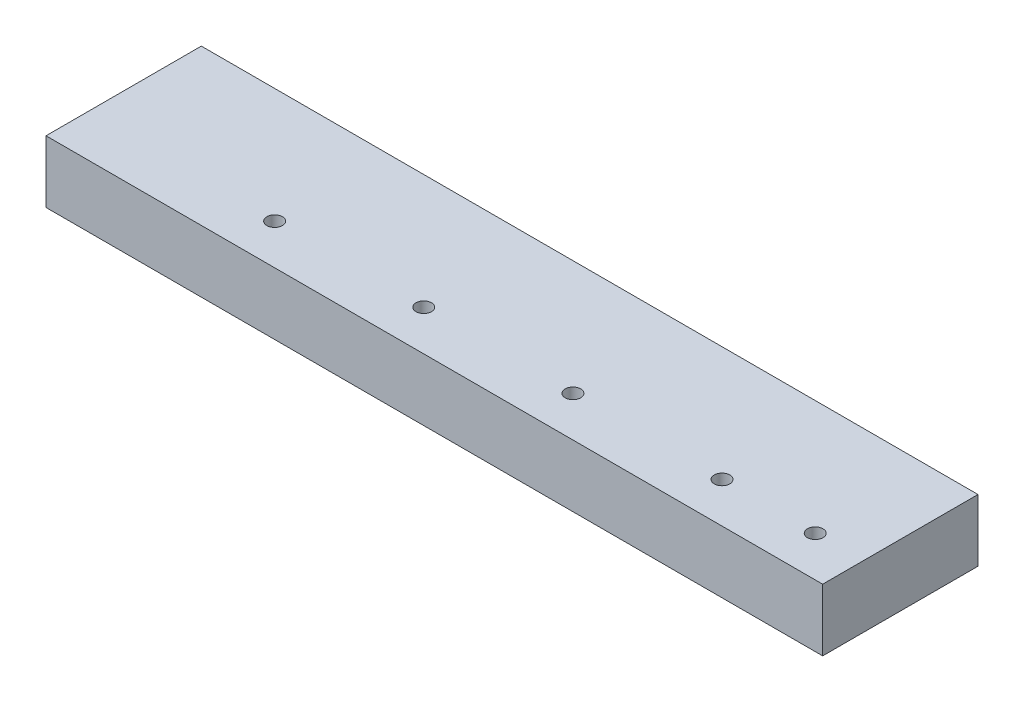
ISO-10303-21;
HEADER;
FILE_DESCRIPTION(('STEP AP214'),'2;1');
FILE_NAME('part.step','',(''),(''),'','','');
FILE_SCHEMA(('AUTOMOTIVE_DESIGN { 1 0 10303 214 1 1 1 1 }'));
ENDSEC;
DATA;
#1=APPLICATION_CONTEXT('core data for automotive mechanical design processes');
#2=APPLICATION_PROTOCOL_DEFINITION('international standard','automotive_design',2000,#1);
#3=PRODUCT_CONTEXT('',#1,'mechanical');
#4=PRODUCT('Part','Part','',(#3));
#5=PRODUCT_RELATED_PRODUCT_CATEGORY('part','',(#4));
#6=PRODUCT_DEFINITION_FORMATION('','',#4);
#7=PRODUCT_DEFINITION_CONTEXT('part definition',#1,'design');
#8=PRODUCT_DEFINITION('design','',#6,#7);
#9=PRODUCT_DEFINITION_SHAPE('','',#8);
#10=(LENGTH_UNIT() NAMED_UNIT(*) SI_UNIT(.MILLI.,.METRE.));
#11=(NAMED_UNIT(*) PLANE_ANGLE_UNIT() SI_UNIT($,.RADIAN.));
#12=(NAMED_UNIT(*) SI_UNIT($,.STERADIAN.) SOLID_ANGLE_UNIT());
#13=UNCERTAINTY_MEASURE_WITH_UNIT(LENGTH_MEASURE(1.E-05),#10,'distance_accuracy_value','');
#14=(GEOMETRIC_REPRESENTATION_CONTEXT(3) GLOBAL_UNCERTAINTY_ASSIGNED_CONTEXT((#13)) GLOBAL_UNIT_ASSIGNED_CONTEXT((#10,
#11,#12)) REPRESENTATION_CONTEXT('',''));
#15=CARTESIAN_POINT('',(0.,0.,0.));
#16=DIRECTION('',(0.,0.,1.));
#17=DIRECTION('',(1.,0.,0.));
#18=AXIS2_PLACEMENT_3D('',#15,#16,#17);
#19=CARTESIAN_POINT('',(-57.3520523439762,-13.3504530011325,25.));
#20=DIRECTION('',(1.,0.,0.));
#21=DIRECTION('',(0.,0.,-1.));
#22=AXIS2_PLACEMENT_3D('',#19,#20,#21);
#23=PLANE('',#22);
#24=DIRECTION('',(0.,-1.,0.));
#25=VECTOR('',#24,1.);
#26=CARTESIAN_POINT('',(-57.3520523439762,-13.3504530011325,0.));
#27=LINE('',#26,#25);
#28=CARTESIAN_POINT('',(-57.3520523439762,-13.3504530011325,0.));
#29=VERTEX_POINT('',#28);
#30=CARTESIAN_POINT('',(-57.3520523439762,-23.3504530011325,0.));
#31=VERTEX_POINT('',#30);
#32=EDGE_CURVE('E110',#29,#31,#27,.T.);
#33=ORIENTED_EDGE('',*,*,#32,.T.);
#34=DIRECTION('',(0.,0.,-1.));
#35=VECTOR('',#34,1.);
#36=CARTESIAN_POINT('',(-57.3520523439762,-23.3504530011325,25.));
#37=LINE('',#36,#35);
#38=CARTESIAN_POINT('',(-57.3520523439762,-23.3504530011325,25.));
#39=VERTEX_POINT('',#38);
#40=EDGE_CURVE('E11',#39,#31,#37,.T.);
#41=ORIENTED_EDGE('',*,*,#40,.F.);
#42=DIRECTION('',(0.,-1.,0.));
#43=VECTOR('',#42,1.);
#44=CARTESIAN_POINT('',(-57.3520523439762,-13.3504530011325,25.));
#45=LINE('',#44,#43);
#46=CARTESIAN_POINT('',(-57.3520523439762,-13.3504530011325,25.));
#47=VERTEX_POINT('',#46);
#48=EDGE_CURVE('E111',#47,#39,#45,.T.);
#49=ORIENTED_EDGE('',*,*,#48,.F.);
#50=DIRECTION('',(0.,0.,-1.));
#51=VECTOR('',#50,1.);
#52=CARTESIAN_POINT('',(-57.3520523439762,-13.3504530011325,25.));
#53=LINE('',#52,#51);
#54=EDGE_CURVE('E117',#47,#29,#53,.T.);
#55=ORIENTED_EDGE('',*,*,#54,.T.);
#56=EDGE_LOOP('',(#33,#41,#49,#55));
#57=FACE_BOUND('',#56,.T.);
#58=ADVANCED_FACE('F33',(#57),#23,.F.);
#59=CARTESIAN_POINT('',(-57.3520523439762,-23.3504530011325,25.));
#60=DIRECTION('',(0.,1.,0.));
#61=DIRECTION('',(0.,0.,1.));
#62=AXIS2_PLACEMENT_3D('',#59,#60,#61);
#63=PLANE('',#62);
#64=CARTESIAN_POINT('',(44.9479476560238,-23.3504530011325,18.5));
#65=DIRECTION('',(0.,1.,0.));
#66=DIRECTION('',(0.,0.,1.));
#67=AXIS2_PLACEMENT_3D('',#64,#65,#66);
#68=CIRCLE('',#67,1.24999999999999);
#69=CARTESIAN_POINT('',(44.9479476560238,-23.3504530011325,19.75));
#70=VERTEX_POINT('',#69);
#71=EDGE_CURVE('E159',#70,#70,#68,.T.);
#72=ORIENTED_EDGE('',*,*,#71,.T.);
#73=EDGE_LOOP('',(#72));
#74=FACE_BOUND('',#73,.T.);
#75=CARTESIAN_POINT('',(20.9479476560238,-23.3504530011325,18.5));
#76=DIRECTION('',(0.,1.,0.));
#77=DIRECTION('',(0.,0.,1.));
#78=AXIS2_PLACEMENT_3D('',#75,#76,#77);
#79=CIRCLE('',#78,1.25);
#80=CARTESIAN_POINT('',(20.9479476560238,-23.3504530011325,19.75));
#81=VERTEX_POINT('',#80);
#82=EDGE_CURVE('E163',#81,#81,#79,.T.);
#83=ORIENTED_EDGE('',*,*,#82,.T.);
#84=EDGE_LOOP('',(#83));
#85=FACE_BOUND('',#84,.T.);
#86=CARTESIAN_POINT('',(-3.05205234397615,-23.3504530011325,18.5));
#87=DIRECTION('',(0.,1.,0.));
#88=DIRECTION('',(0.,0.,1.));
#89=AXIS2_PLACEMENT_3D('',#86,#87,#88);
#90=CIRCLE('',#89,1.25);
#91=CARTESIAN_POINT('',(-3.05205234397615,-23.3504530011325,19.75));
#92=VERTEX_POINT('',#91);
#93=EDGE_CURVE('E167',#92,#92,#90,.T.);
#94=ORIENTED_EDGE('',*,*,#93,.T.);
#95=EDGE_LOOP('',(#94));
#96=FACE_BOUND('',#95,.T.);
#97=CARTESIAN_POINT('',(-27.0520523439762,-23.3504530011325,18.5));
#98=DIRECTION('',(0.,1.,0.));
#99=DIRECTION('',(0.,0.,1.));
#100=AXIS2_PLACEMENT_3D('',#97,#98,#99);
#101=CIRCLE('',#100,1.25);
#102=CARTESIAN_POINT('',(-27.0520523439762,-23.3504530011325,19.75));
#103=VERTEX_POINT('',#102);
#104=EDGE_CURVE('E171',#103,#103,#101,.T.);
#105=ORIENTED_EDGE('',*,*,#104,.T.);
#106=EDGE_LOOP('',(#105));
#107=FACE_BOUND('',#106,.T.);
#108=CARTESIAN_POINT('',(59.9479476560238,-23.3504530011325,18.5));
#109=DIRECTION('',(0.,1.,0.));
#110=DIRECTION('',(0.,0.,1.));
#111=AXIS2_PLACEMENT_3D('',#108,#109,#110);
#112=CIRCLE('',#111,1.24999999999999);
#113=CARTESIAN_POINT('',(59.9479476560238,-23.3504530011325,19.75));
#114=VERTEX_POINT('',#113);
#115=EDGE_CURVE('E104',#114,#114,#112,.T.);
#116=ORIENTED_EDGE('',*,*,#115,.T.);
#117=EDGE_LOOP('',(#116));
#118=FACE_BOUND('',#117,.T.);
#119=DIRECTION('',(1.,0.,0.));
#120=VECTOR('',#119,1.);
#121=CARTESIAN_POINT('',(-57.3520523439762,-23.3504530011325,0.));
#122=LINE('',#121,#120);
#123=CARTESIAN_POINT('',(67.6479476560238,-23.3504530011325,0.));
#124=VERTEX_POINT('',#123);
#125=EDGE_CURVE('E120',#31,#124,#122,.T.);
#126=ORIENTED_EDGE('',*,*,#125,.T.);
#127=DIRECTION('',(0.,0.,-1.));
#128=VECTOR('',#127,1.);
#129=CARTESIAN_POINT('',(67.6479476560238,-23.3504530011325,25.));
#130=LINE('',#129,#128);
#131=CARTESIAN_POINT('',(67.6479476560238,-23.3504530011325,25.));
#132=VERTEX_POINT('',#131);
#133=EDGE_CURVE('E41',#132,#124,#130,.T.);
#134=ORIENTED_EDGE('',*,*,#133,.F.);
#135=DIRECTION('',(1.,0.,0.));
#136=VECTOR('',#135,1.);
#137=CARTESIAN_POINT('',(-57.3520523439762,-23.3504530011325,25.));
#138=LINE('',#137,#136);
#139=EDGE_CURVE('E80',#39,#132,#138,.T.);
#140=ORIENTED_EDGE('',*,*,#139,.F.);
#141=ORIENTED_EDGE('',*,*,#40,.T.);
#142=EDGE_LOOP('',(#126,#134,#140,#141));
#143=FACE_BOUND('',#142,.T.);
#144=ADVANCED_FACE('F144',(#74,#85,#96,#107,#118,#143),#63,.F.);
#145=CARTESIAN_POINT('',(67.6479476560238,-13.3504530011325,25.));
#146=DIRECTION('',(-1.,0.,0.));
#147=DIRECTION('',(0.,0.,1.));
#148=AXIS2_PLACEMENT_3D('',#145,#146,#147);
#149=PLANE('',#148);
#150=DIRECTION('',(0.,1.,0.));
#151=VECTOR('',#150,1.);
#152=CARTESIAN_POINT('',(67.6479476560238,-13.3504530011325,0.));
#153=LINE('',#152,#151);
#154=CARTESIAN_POINT('',(67.6479476560238,-13.3504530011325,0.));
#155=VERTEX_POINT('',#154);
#156=EDGE_CURVE('E67',#124,#155,#153,.T.);
#157=ORIENTED_EDGE('',*,*,#156,.T.);
#158=DIRECTION('',(0.,0.,-1.));
#159=VECTOR('',#158,1.);
#160=CARTESIAN_POINT('',(67.6479476560238,-13.3504530011325,25.));
#161=LINE('',#160,#159);
#162=CARTESIAN_POINT('',(67.6479476560238,-13.3504530011325,25.));
#163=VERTEX_POINT('',#162);
#164=EDGE_CURVE('E125',#163,#155,#161,.T.);
#165=ORIENTED_EDGE('',*,*,#164,.F.);
#166=DIRECTION('',(0.,1.,0.));
#167=VECTOR('',#166,1.);
#168=CARTESIAN_POINT('',(67.6479476560238,-13.3504530011325,25.));
#169=LINE('',#168,#167);
#170=EDGE_CURVE('E114',#132,#163,#169,.T.);
#171=ORIENTED_EDGE('',*,*,#170,.F.);
#172=ORIENTED_EDGE('',*,*,#133,.T.);
#173=EDGE_LOOP('',(#157,#165,#171,#172));
#174=FACE_BOUND('',#173,.T.);
#175=ADVANCED_FACE('F127',(#174),#149,.F.);
#176=CARTESIAN_POINT('',(-57.3520523439762,-13.3504530011325,25.));
#177=DIRECTION('',(0.,-1.,0.));
#178=DIRECTION('',(0.,0.,-1.));
#179=AXIS2_PLACEMENT_3D('',#176,#177,#178);
#180=PLANE('',#179);
#181=CARTESIAN_POINT('',(44.9479476560238,-13.3504530011325,18.5));
#182=DIRECTION('',(0.,1.,0.));
#183=DIRECTION('',(0.,0.,1.));
#184=AXIS2_PLACEMENT_3D('',#181,#182,#183);
#185=CIRCLE('',#184,1.25);
#186=CARTESIAN_POINT('',(44.9479476560238,-13.3504530011325,19.75));
#187=VERTEX_POINT('',#186);
#188=EDGE_CURVE('E192',#187,#187,#185,.T.);
#189=ORIENTED_EDGE('',*,*,#188,.F.);
#190=EDGE_LOOP('',(#189));
#191=FACE_BOUND('',#190,.T.);
#192=CARTESIAN_POINT('',(20.9479476560238,-13.3504530011325,18.5));
#193=DIRECTION('',(0.,1.,0.));
#194=DIRECTION('',(0.,0.,1.));
#195=AXIS2_PLACEMENT_3D('',#192,#193,#194);
#196=CIRCLE('',#195,1.25);
#197=CARTESIAN_POINT('',(20.9479476560238,-13.3504530011325,19.75));
#198=VERTEX_POINT('',#197);
#199=EDGE_CURVE('E188',#198,#198,#196,.T.);
#200=ORIENTED_EDGE('',*,*,#199,.F.);
#201=EDGE_LOOP('',(#200));
#202=FACE_BOUND('',#201,.T.);
#203=CARTESIAN_POINT('',(-3.05205234397615,-13.3504530011325,18.5));
#204=DIRECTION('',(0.,1.,0.));
#205=DIRECTION('',(0.,0.,1.));
#206=AXIS2_PLACEMENT_3D('',#203,#204,#205);
#207=CIRCLE('',#206,1.25);
#208=CARTESIAN_POINT('',(-3.05205234397615,-13.3504530011325,19.75));
#209=VERTEX_POINT('',#208);
#210=EDGE_CURVE('E184',#209,#209,#207,.T.);
#211=ORIENTED_EDGE('',*,*,#210,.F.);
#212=EDGE_LOOP('',(#211));
#213=FACE_BOUND('',#212,.T.);
#214=CARTESIAN_POINT('',(-27.0520523439762,-13.3504530011325,18.5));
#215=DIRECTION('',(0.,1.,0.));
#216=DIRECTION('',(0.,0.,1.));
#217=AXIS2_PLACEMENT_3D('',#214,#215,#216);
#218=CIRCLE('',#217,1.25);
#219=CARTESIAN_POINT('',(-27.0520523439762,-13.3504530011325,19.75));
#220=VERTEX_POINT('',#219);
#221=EDGE_CURVE('E180',#220,#220,#218,.T.);
#222=ORIENTED_EDGE('',*,*,#221,.F.);
#223=EDGE_LOOP('',(#222));
#224=FACE_BOUND('',#223,.T.);
#225=CARTESIAN_POINT('',(59.9479476560238,-13.3504530011325,18.5));
#226=DIRECTION('',(0.,1.,0.));
#227=DIRECTION('',(0.,0.,1.));
#228=AXIS2_PLACEMENT_3D('',#225,#226,#227);
#229=CIRCLE('',#228,1.25);
#230=CARTESIAN_POINT('',(59.9479476560238,-13.3504530011325,19.75));
#231=VERTEX_POINT('',#230);
#232=EDGE_CURVE('E175',#231,#231,#229,.T.);
#233=ORIENTED_EDGE('',*,*,#232,.F.);
#234=EDGE_LOOP('',(#233));
#235=FACE_BOUND('',#234,.T.);
#236=DIRECTION('',(-1.,0.,0.));
#237=VECTOR('',#236,1.);
#238=CARTESIAN_POINT('',(-57.3520523439762,-13.3504530011325,0.));
#239=LINE('',#238,#237);
#240=EDGE_CURVE('E73',#155,#29,#239,.T.);
#241=ORIENTED_EDGE('',*,*,#240,.T.);
#242=ORIENTED_EDGE('',*,*,#54,.F.);
#243=DIRECTION('',(-1.,0.,0.));
#244=VECTOR('',#243,1.);
#245=CARTESIAN_POINT('',(-57.3520523439762,-13.3504530011325,25.));
#246=LINE('',#245,#244);
#247=EDGE_CURVE('E49',#163,#47,#246,.T.);
#248=ORIENTED_EDGE('',*,*,#247,.F.);
#249=ORIENTED_EDGE('',*,*,#164,.T.);
#250=EDGE_LOOP('',(#241,#242,#248,#249));
#251=FACE_BOUND('',#250,.T.);
#252=ADVANCED_FACE('F134',(#191,#202,#213,#224,#235,#251),#180,.F.);
#253=CARTESIAN_POINT('',(-57.3520523439762,-23.3504530011325,25.));
#254=DIRECTION('',(0.,0.,1.));
#255=DIRECTION('',(1.,0.,0.));
#256=AXIS2_PLACEMENT_3D('',#253,#254,#255);
#257=PLANE('',#256);
#258=ORIENTED_EDGE('',*,*,#48,.T.);
#259=ORIENTED_EDGE('',*,*,#139,.T.);
#260=ORIENTED_EDGE('',*,*,#170,.T.);
#261=ORIENTED_EDGE('',*,*,#247,.T.);
#262=EDGE_LOOP('',(#258,#259,#260,#261));
#263=FACE_BOUND('',#262,.T.);
#264=ADVANCED_FACE('F136',(#263),#257,.T.);
#265=CARTESIAN_POINT('',(-57.3520523439762,-23.3504530011325,0.));
#266=DIRECTION('',(0.,0.,1.));
#267=DIRECTION('',(1.,0.,0.));
#268=AXIS2_PLACEMENT_3D('',#265,#266,#267);
#269=PLANE('',#268);
#270=CARTESIAN_POINT('',(62.6479476560238,-18.3504530011325,0.));
#271=DIRECTION('',(0.,0.,-1.));
#272=DIRECTION('',(-1.,0.,0.));
#273=AXIS2_PLACEMENT_3D('',#270,#271,#272);
#274=CIRCLE('',#273,1.25);
#275=CARTESIAN_POINT('',(61.3979476560238,-18.3504530011325,0.));
#276=VERTEX_POINT('',#275);
#277=EDGE_CURVE('E98',#276,#276,#274,.T.);
#278=ORIENTED_EDGE('',*,*,#277,.F.);
#279=EDGE_LOOP('',(#278));
#280=FACE_BOUND('',#279,.T.);
#281=CARTESIAN_POINT('',(-52.3520523439762,-18.3504530011325,0.));
#282=DIRECTION('',(0.,0.,-1.));
#283=DIRECTION('',(-1.,0.,0.));
#284=AXIS2_PLACEMENT_3D('',#281,#282,#283);
#285=CIRCLE('',#284,1.25);
#286=CARTESIAN_POINT('',(-53.6020523439762,-18.3504530011325,0.));
#287=VERTEX_POINT('',#286);
#288=EDGE_CURVE('E97',#287,#287,#285,.T.);
#289=ORIENTED_EDGE('',*,*,#288,.F.);
#290=EDGE_LOOP('',(#289));
#291=FACE_BOUND('',#290,.T.);
#292=ORIENTED_EDGE('',*,*,#32,.F.);
#293=ORIENTED_EDGE('',*,*,#240,.F.);
#294=ORIENTED_EDGE('',*,*,#156,.F.);
#295=ORIENTED_EDGE('',*,*,#125,.F.);
#296=EDGE_LOOP('',(#292,#293,#294,#295));
#297=FACE_BOUND('',#296,.T.);
#298=ADVANCED_FACE('F130',(#280,#291,#297),#269,.F.);
#299=CARTESIAN_POINT('',(-52.3520523439762,-18.3504530011325,12.5));
#300=DIRECTION('',(0.,0.,-1.));
#301=DIRECTION('',(-1.,0.,0.));
#302=AXIS2_PLACEMENT_3D('',#299,#300,#301);
#303=CONICAL_SURFACE('',#302,1.24999999999999,1.02974425867665);
#304=CARTESIAN_POINT('',(-52.3520523439762,-18.3504530011325,13.2510757737845));
#305=VERTEX_POINT('',#304);
#306=VERTEX_LOOP('',#305);
#307=FACE_BOUND('',#306,.T.);
#308=CARTESIAN_POINT('',(-52.3520523439762,-18.3504530011325,12.5));
#309=DIRECTION('',(0.,0.,-1.));
#310=DIRECTION('',(-1.,0.,0.));
#311=AXIS2_PLACEMENT_3D('',#308,#309,#310);
#312=CIRCLE('',#311,1.24999999999999);
#313=CARTESIAN_POINT('',(-53.6020523439761,-18.3504530011325,12.5));
#314=VERTEX_POINT('',#313);
#315=EDGE_CURVE('E101',#314,#314,#312,.T.);
#316=ORIENTED_EDGE('',*,*,#315,.T.);
#317=EDGE_LOOP('',(#316));
#318=FACE_BOUND('',#317,.T.);
#319=ADVANCED_FACE('F221',(#307,#318),#303,.F.);
#320=CARTESIAN_POINT('',(-52.3520523439762,-18.3504530011325,0.));
#321=DIRECTION('',(0.,0.,-1.));
#322=DIRECTION('',(-1.,0.,0.));
#323=AXIS2_PLACEMENT_3D('',#320,#321,#322);
#324=CYLINDRICAL_SURFACE('',#323,1.25);
#325=ORIENTED_EDGE('',*,*,#315,.F.);
#326=EDGE_LOOP('',(#325));
#327=FACE_BOUND('',#326,.T.);
#328=ORIENTED_EDGE('',*,*,#288,.T.);
#329=EDGE_LOOP('',(#328));
#330=FACE_BOUND('',#329,.T.);
#331=ADVANCED_FACE('F91',(#327,#330),#324,.F.);
#332=CARTESIAN_POINT('',(62.6479476560238,-18.3504530011325,12.5));
#333=DIRECTION('',(0.,0.,-1.));
#334=DIRECTION('',(-1.,0.,0.));
#335=AXIS2_PLACEMENT_3D('',#332,#333,#334);
#336=CONICAL_SURFACE('',#335,1.25,1.02974425867666);
#337=CARTESIAN_POINT('',(62.6479476560238,-18.3504530011325,13.2510757737845));
#338=VERTEX_POINT('',#337);
#339=VERTEX_LOOP('',#338);
#340=FACE_BOUND('',#339,.T.);
#341=CARTESIAN_POINT('',(62.6479476560238,-18.3504530011325,12.5));
#342=DIRECTION('',(0.,0.,-1.));
#343=DIRECTION('',(-1.,0.,0.));
#344=AXIS2_PLACEMENT_3D('',#341,#342,#343);
#345=CIRCLE('',#344,1.25);
#346=CARTESIAN_POINT('',(61.3979476560238,-18.3504530011325,12.5));
#347=VERTEX_POINT('',#346);
#348=EDGE_CURVE('E95',#347,#347,#345,.T.);
#349=ORIENTED_EDGE('',*,*,#348,.T.);
#350=EDGE_LOOP('',(#349));
#351=FACE_BOUND('',#350,.T.);
#352=ADVANCED_FACE('F87',(#340,#351),#336,.F.);
#353=CARTESIAN_POINT('',(62.6479476560238,-18.3504530011325,0.));
#354=DIRECTION('',(0.,0.,-1.));
#355=DIRECTION('',(-1.,0.,0.));
#356=AXIS2_PLACEMENT_3D('',#353,#354,#355);
#357=CYLINDRICAL_SURFACE('',#356,1.25);
#358=ORIENTED_EDGE('',*,*,#348,.F.);
#359=EDGE_LOOP('',(#358));
#360=FACE_BOUND('',#359,.T.);
#361=ORIENTED_EDGE('',*,*,#277,.T.);
#362=EDGE_LOOP('',(#361));
#363=FACE_BOUND('',#362,.T.);
#364=ADVANCED_FACE('F90',(#360,#363),#357,.F.);
#365=CARTESIAN_POINT('',(59.9479476560238,-13.3504530011325,18.5));
#366=DIRECTION('',(0.,1.,0.));
#367=DIRECTION('',(0.,0.,1.));
#368=AXIS2_PLACEMENT_3D('',#365,#366,#367);
#369=CYLINDRICAL_SURFACE('',#368,1.25);
#370=ORIENTED_EDGE('',*,*,#115,.F.);
#371=EDGE_LOOP('',(#370));
#372=FACE_BOUND('',#371,.T.);
#373=ORIENTED_EDGE('',*,*,#232,.T.);
#374=EDGE_LOOP('',(#373));
#375=FACE_BOUND('',#374,.T.);
#376=ADVANCED_FACE('F213',(#372,#375),#369,.F.);
#377=CARTESIAN_POINT('',(-27.0520523439762,-13.3504530011325,18.5));
#378=DIRECTION('',(0.,1.,0.));
#379=DIRECTION('',(0.,0.,1.));
#380=AXIS2_PLACEMENT_3D('',#377,#378,#379);
#381=CYLINDRICAL_SURFACE('',#380,1.25);
#382=ORIENTED_EDGE('',*,*,#104,.F.);
#383=EDGE_LOOP('',(#382));
#384=FACE_BOUND('',#383,.T.);
#385=ORIENTED_EDGE('',*,*,#221,.T.);
#386=EDGE_LOOP('',(#385));
#387=FACE_BOUND('',#386,.T.);
#388=ADVANCED_FACE('F209',(#384,#387),#381,.F.);
#389=CARTESIAN_POINT('',(-3.05205234397615,-13.3504530011325,18.5));
#390=DIRECTION('',(0.,1.,0.));
#391=DIRECTION('',(0.,0.,1.));
#392=AXIS2_PLACEMENT_3D('',#389,#390,#391);
#393=CYLINDRICAL_SURFACE('',#392,1.25);
#394=ORIENTED_EDGE('',*,*,#93,.F.);
#395=EDGE_LOOP('',(#394));
#396=FACE_BOUND('',#395,.T.);
#397=ORIENTED_EDGE('',*,*,#210,.T.);
#398=EDGE_LOOP('',(#397));
#399=FACE_BOUND('',#398,.T.);
#400=ADVANCED_FACE('F203',(#396,#399),#393,.F.);
#401=CARTESIAN_POINT('',(20.9479476560238,-13.3504530011325,18.5));
#402=DIRECTION('',(0.,1.,0.));
#403=DIRECTION('',(0.,0.,1.));
#404=AXIS2_PLACEMENT_3D('',#401,#402,#403);
#405=CYLINDRICAL_SURFACE('',#404,1.25);
#406=ORIENTED_EDGE('',*,*,#82,.F.);
#407=EDGE_LOOP('',(#406));
#408=FACE_BOUND('',#407,.T.);
#409=ORIENTED_EDGE('',*,*,#199,.T.);
#410=EDGE_LOOP('',(#409));
#411=FACE_BOUND('',#410,.T.);
#412=ADVANCED_FACE('F197',(#408,#411),#405,.F.);
#413=CARTESIAN_POINT('',(44.9479476560238,-13.3504530011325,18.5));
#414=DIRECTION('',(0.,1.,0.));
#415=DIRECTION('',(0.,0.,1.));
#416=AXIS2_PLACEMENT_3D('',#413,#414,#415);
#417=CYLINDRICAL_SURFACE('',#416,1.25);
#418=ORIENTED_EDGE('',*,*,#71,.F.);
#419=EDGE_LOOP('',(#418));
#420=FACE_BOUND('',#419,.T.);
#421=ORIENTED_EDGE('',*,*,#188,.T.);
#422=EDGE_LOOP('',(#421));
#423=FACE_BOUND('',#422,.T.);
#424=ADVANCED_FACE('F195',(#420,#423),#417,.F.);
#425=CLOSED_SHELL('',(#58,#144,#175,#252,#264,#298,#319,#331,#352,#364,#376,#388,#400,#412,#424));
#426=MANIFOLD_SOLID_BREP('B2',#425);
#427=ADVANCED_BREP_SHAPE_REPRESENTATION('',(#18,#426),#14);
#428=SHAPE_DEFINITION_REPRESENTATION(#9,#427);
ENDSEC;
END-ISO-10303-21;
